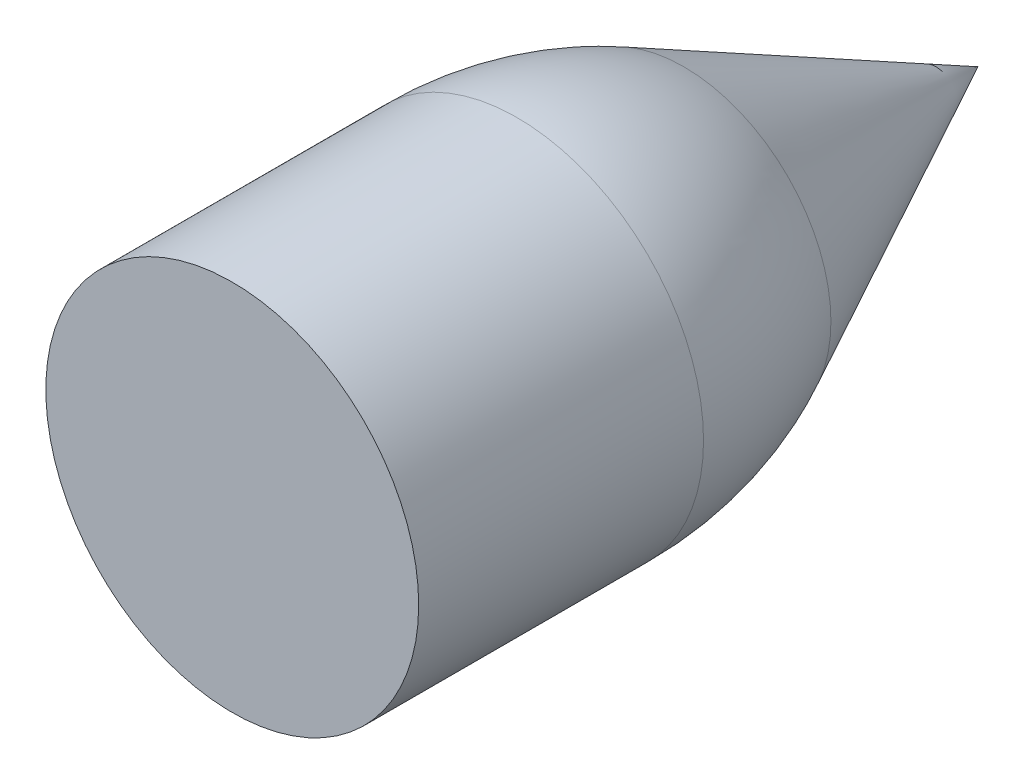
ISO-10303-21;
HEADER;
FILE_DESCRIPTION(('STEP AP214'),'2;1');
FILE_NAME('part.step','',(''),(''),'','','');
FILE_SCHEMA(('AUTOMOTIVE_DESIGN { 1 0 10303 214 1 1 1 1 }'));
ENDSEC;
DATA;
#1=APPLICATION_CONTEXT('core data for automotive mechanical design processes');
#2=APPLICATION_PROTOCOL_DEFINITION('international standard','automotive_design',2000,#1);
#3=PRODUCT_CONTEXT('',#1,'mechanical');
#4=PRODUCT('Part','Part','',(#3));
#5=PRODUCT_RELATED_PRODUCT_CATEGORY('part','',(#4));
#6=PRODUCT_DEFINITION_FORMATION('','',#4);
#7=PRODUCT_DEFINITION_CONTEXT('part definition',#1,'design');
#8=PRODUCT_DEFINITION('design','',#6,#7);
#9=PRODUCT_DEFINITION_SHAPE('','',#8);
#10=(LENGTH_UNIT() NAMED_UNIT(*) SI_UNIT(.MILLI.,.METRE.));
#11=(NAMED_UNIT(*) PLANE_ANGLE_UNIT() SI_UNIT($,.RADIAN.));
#12=(NAMED_UNIT(*) SI_UNIT($,.STERADIAN.) SOLID_ANGLE_UNIT());
#13=UNCERTAINTY_MEASURE_WITH_UNIT(LENGTH_MEASURE(1.E-05),#10,'distance_accuracy_value','');
#14=(GEOMETRIC_REPRESENTATION_CONTEXT(3) GLOBAL_UNCERTAINTY_ASSIGNED_CONTEXT((#13)) GLOBAL_UNIT_ASSIGNED_CONTEXT((#10,
#11,#12)) REPRESENTATION_CONTEXT('',''));
#15=CARTESIAN_POINT('',(0.,0.,0.));
#16=DIRECTION('',(0.,0.,1.));
#17=DIRECTION('',(1.,0.,0.));
#18=AXIS2_PLACEMENT_3D('',#15,#16,#17);
#19=CARTESIAN_POINT('',(0.,0.,0.));
#20=DIRECTION('',(0.,0.,1.));
#21=DIRECTION('',(1.,0.,0.));
#22=AXIS2_PLACEMENT_3D('',#19,#20,#21);
#23=PLANE('',#22);
#24=CARTESIAN_POINT('',(0.,0.,0.));
#25=DIRECTION('',(0.,0.,1.));
#26=DIRECTION('',(1.,0.,0.));
#27=AXIS2_PLACEMENT_3D('',#24,#25,#26);
#28=CIRCLE('',#27,5.);
#29=CARTESIAN_POINT('',(5.,0.,0.));
#30=VERTEX_POINT('',#29);
#31=EDGE_CURVE('E55',#30,#30,#28,.T.);
#32=ORIENTED_EDGE('',*,*,#31,.T.);
#33=EDGE_LOOP('',(#32));
#34=FACE_BOUND('',#33,.T.);
#35=ADVANCED_FACE('F33',(#34),#23,.T.);
#36=CARTESIAN_POINT('',(0.,0.,-12.1114561800017));
#37=DIRECTION('',(0.,0.,1.));
#38=DIRECTION('',(1.,0.,0.));
#39=AXIS2_PLACEMENT_3D('',#36,#37,#38);
#40=CONICAL_SURFACE('',#39,3.94427190999914,0.463647609000806);
#41=CARTESIAN_POINT('',(0.,0.,-20.));
#42=VERTEX_POINT('',#41);
#43=VERTEX_LOOP('',#42);
#44=FACE_BOUND('',#43,.T.);
#45=CARTESIAN_POINT('',(0.,0.,-12.1114561800017));
#46=DIRECTION('',(0.,0.,1.));
#47=DIRECTION('',(1.,0.,0.));
#48=AXIS2_PLACEMENT_3D('',#45,#46,#47);
#49=CIRCLE('',#48,3.94427190999914);
#50=CARTESIAN_POINT('',(3.94427190999914,0.,-12.1114561800017));
#51=VERTEX_POINT('',#50);
#52=EDGE_CURVE('E11',#51,#51,#49,.T.);
#53=ORIENTED_EDGE('',*,*,#52,.F.);
#54=EDGE_LOOP('',(#53));
#55=FACE_BOUND('',#54,.T.);
#56=ADVANCED_FACE('F42',(#44,#55),#40,.T.);
#57=CARTESIAN_POINT('',(0.,0.,-7.63932022500211));
#58=DIRECTION('',(0.,0.,1.));
#59=DIRECTION('',(1.,0.,0.));
#60=AXIS2_PLACEMENT_3D('',#57,#58,#59);
#61=DEGENERATE_TOROIDAL_SURFACE('',#60,5.,10.,.F.);
#62=ORIENTED_EDGE('',*,*,#52,.T.);
#63=EDGE_LOOP('',(#62));
#64=FACE_BOUND('',#63,.T.);
#65=CARTESIAN_POINT('',(0.,0.,-7.63932022500207));
#66=DIRECTION('',(0.,0.,1.));
#67=DIRECTION('',(1.,0.,0.));
#68=AXIS2_PLACEMENT_3D('',#65,#66,#67);
#69=CIRCLE('',#68,5.);
#70=CARTESIAN_POINT('',(5.,0.,-7.63932022500207));
#71=VERTEX_POINT('',#70);
#72=EDGE_CURVE('E39',#71,#71,#69,.T.);
#73=ORIENTED_EDGE('',*,*,#72,.F.);
#74=EDGE_LOOP('',(#73));
#75=FACE_BOUND('',#74,.T.);
#76=ADVANCED_FACE('F45',(#64,#75),#61,.F.);
#77=CARTESIAN_POINT('',(0.,0.,0.));
#78=DIRECTION('',(0.,0.,1.));
#79=DIRECTION('',(1.,0.,0.));
#80=AXIS2_PLACEMENT_3D('',#77,#78,#79);
#81=CYLINDRICAL_SURFACE('',#80,5.);
#82=ORIENTED_EDGE('',*,*,#72,.T.);
#83=EDGE_LOOP('',(#82));
#84=FACE_BOUND('',#83,.T.);
#85=ORIENTED_EDGE('',*,*,#31,.F.);
#86=EDGE_LOOP('',(#85));
#87=FACE_BOUND('',#86,.T.);
#88=ADVANCED_FACE('F50',(#84,#87),#81,.T.);
#89=CLOSED_SHELL('',(#35,#56,#76,#88));
#90=MANIFOLD_SOLID_BREP('B2',#89);
#91=ADVANCED_BREP_SHAPE_REPRESENTATION('',(#18,#90),#14);
#92=SHAPE_DEFINITION_REPRESENTATION(#9,#91);
ENDSEC;
END-ISO-10303-21;
